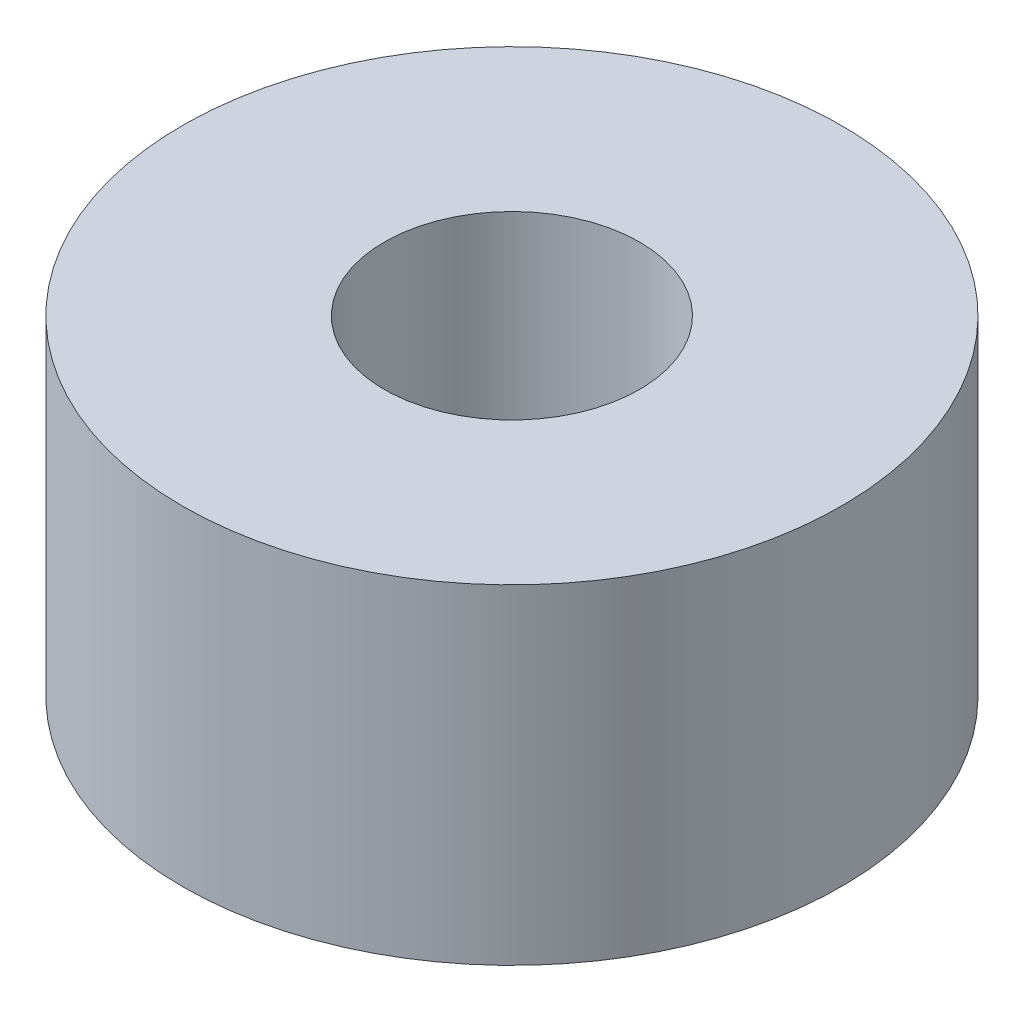
ISO-10303-21;
HEADER;
FILE_DESCRIPTION(('STEP AP214'),'2;1');
FILE_NAME('part.step','',(''),(''),'','','');
FILE_SCHEMA(('AUTOMOTIVE_DESIGN { 1 0 10303 214 1 1 1 1 }'));
ENDSEC;
DATA;
#1=APPLICATION_CONTEXT('core data for automotive mechanical design processes');
#2=APPLICATION_PROTOCOL_DEFINITION('international standard','automotive_design',2000,#1);
#3=PRODUCT_CONTEXT('',#1,'mechanical');
#4=PRODUCT('Part','Part','',(#3));
#5=PRODUCT_RELATED_PRODUCT_CATEGORY('part','',(#4));
#6=PRODUCT_DEFINITION_FORMATION('','',#4);
#7=PRODUCT_DEFINITION_CONTEXT('part definition',#1,'design');
#8=PRODUCT_DEFINITION('design','',#6,#7);
#9=PRODUCT_DEFINITION_SHAPE('','',#8);
#10=(LENGTH_UNIT() NAMED_UNIT(*) SI_UNIT(.MILLI.,.METRE.));
#11=(NAMED_UNIT(*) PLANE_ANGLE_UNIT() SI_UNIT($,.RADIAN.));
#12=(NAMED_UNIT(*) SI_UNIT($,.STERADIAN.) SOLID_ANGLE_UNIT());
#13=UNCERTAINTY_MEASURE_WITH_UNIT(LENGTH_MEASURE(1.E-05),#10,'distance_accuracy_value','');
#14=(GEOMETRIC_REPRESENTATION_CONTEXT(3) GLOBAL_UNCERTAINTY_ASSIGNED_CONTEXT((#13)) GLOBAL_UNIT_ASSIGNED_CONTEXT((#10,
#11,#12)) REPRESENTATION_CONTEXT('',''));
#15=CARTESIAN_POINT('',(0.,0.,0.));
#16=DIRECTION('',(0.,0.,1.));
#17=DIRECTION('',(1.,0.,0.));
#18=AXIS2_PLACEMENT_3D('',#15,#16,#17);
#19=CARTESIAN_POINT('',(0.,4.,0.));
#20=DIRECTION('',(0.,-1.,0.));
#21=DIRECTION('',(0.,0.,-1.));
#22=AXIS2_PLACEMENT_3D('',#19,#20,#21);
#23=CYLINDRICAL_SURFACE('',#22,4.);
#24=CARTESIAN_POINT('',(0.,4.,0.));
#25=DIRECTION('',(0.,1.,0.));
#26=DIRECTION('',(0.,0.,1.));
#27=AXIS2_PLACEMENT_3D('',#24,#25,#26);
#28=CIRCLE('',#27,4.);
#29=CARTESIAN_POINT('',(0.,4.,4.));
#30=VERTEX_POINT('',#29);
#31=EDGE_CURVE('E10',#30,#30,#28,.T.);
#32=ORIENTED_EDGE('',*,*,#31,.F.);
#33=EDGE_LOOP('',(#32));
#34=FACE_BOUND('',#33,.T.);
#35=CARTESIAN_POINT('',(0.,0.,0.));
#36=DIRECTION('',(0.,1.,0.));
#37=DIRECTION('',(0.,0.,1.));
#38=AXIS2_PLACEMENT_3D('',#35,#36,#37);
#39=CIRCLE('',#38,4.);
#40=CARTESIAN_POINT('',(0.,0.,4.));
#41=VERTEX_POINT('',#40);
#42=EDGE_CURVE('E40',#41,#41,#39,.T.);
#43=ORIENTED_EDGE('',*,*,#42,.T.);
#44=EDGE_LOOP('',(#43));
#45=FACE_BOUND('',#44,.T.);
#46=ADVANCED_FACE('F37',(#34,#45),#23,.T.);
#47=CARTESIAN_POINT('',(0.,4.,0.));
#48=DIRECTION('',(0.,1.,0.));
#49=DIRECTION('',(0.,0.,1.));
#50=AXIS2_PLACEMENT_3D('',#47,#48,#49);
#51=PLANE('',#50);
#52=CARTESIAN_POINT('',(0.,4.,0.));
#53=DIRECTION('',(0.,-1.,0.));
#54=DIRECTION('',(0.,0.,-1.));
#55=AXIS2_PLACEMENT_3D('',#52,#53,#54);
#56=CIRCLE('',#55,1.55);
#57=CARTESIAN_POINT('',(0.,4.,-1.55));
#58=VERTEX_POINT('',#57);
#59=EDGE_CURVE('E49',#58,#58,#56,.T.);
#60=ORIENTED_EDGE('',*,*,#59,.T.);
#61=EDGE_LOOP('',(#60));
#62=FACE_BOUND('',#61,.T.);
#63=ORIENTED_EDGE('',*,*,#31,.T.);
#64=EDGE_LOOP('',(#63));
#65=FACE_BOUND('',#64,.T.);
#66=ADVANCED_FACE('F64',(#62,#65),#51,.T.);
#67=CARTESIAN_POINT('',(0.,0.,0.));
#68=DIRECTION('',(0.,1.,0.));
#69=DIRECTION('',(0.,0.,1.));
#70=AXIS2_PLACEMENT_3D('',#67,#68,#69);
#71=PLANE('',#70);
#72=CARTESIAN_POINT('',(0.,0.,0.));
#73=DIRECTION('',(0.,-1.,0.));
#74=DIRECTION('',(0.,0.,-1.));
#75=AXIS2_PLACEMENT_3D('',#72,#73,#74);
#76=CIRCLE('',#75,1.55);
#77=CARTESIAN_POINT('',(0.,0.,-1.55));
#78=VERTEX_POINT('',#77);
#79=EDGE_CURVE('E54',#78,#78,#76,.T.);
#80=ORIENTED_EDGE('',*,*,#79,.F.);
#81=EDGE_LOOP('',(#80));
#82=FACE_BOUND('',#81,.T.);
#83=ORIENTED_EDGE('',*,*,#42,.F.);
#84=EDGE_LOOP('',(#83));
#85=FACE_BOUND('',#84,.T.);
#86=ADVANCED_FACE('F61',(#82,#85),#71,.F.);
#87=CARTESIAN_POINT('',(0.,0.,0.));
#88=DIRECTION('',(0.,-1.,0.));
#89=DIRECTION('',(0.,0.,-1.));
#90=AXIS2_PLACEMENT_3D('',#87,#88,#89);
#91=CYLINDRICAL_SURFACE('',#90,1.55);
#92=ORIENTED_EDGE('',*,*,#59,.F.);
#93=EDGE_LOOP('',(#92));
#94=FACE_BOUND('',#93,.T.);
#95=ORIENTED_EDGE('',*,*,#79,.T.);
#96=EDGE_LOOP('',(#95));
#97=FACE_BOUND('',#96,.T.);
#98=ADVANCED_FACE('F59',(#94,#97),#91,.F.);
#99=CLOSED_SHELL('',(#46,#66,#86,#98));
#100=MANIFOLD_SOLID_BREP('B2',#99);
#101=ADVANCED_BREP_SHAPE_REPRESENTATION('',(#18,#100),#14);
#102=SHAPE_DEFINITION_REPRESENTATION(#9,#101);
ENDSEC;
END-ISO-10303-21;
